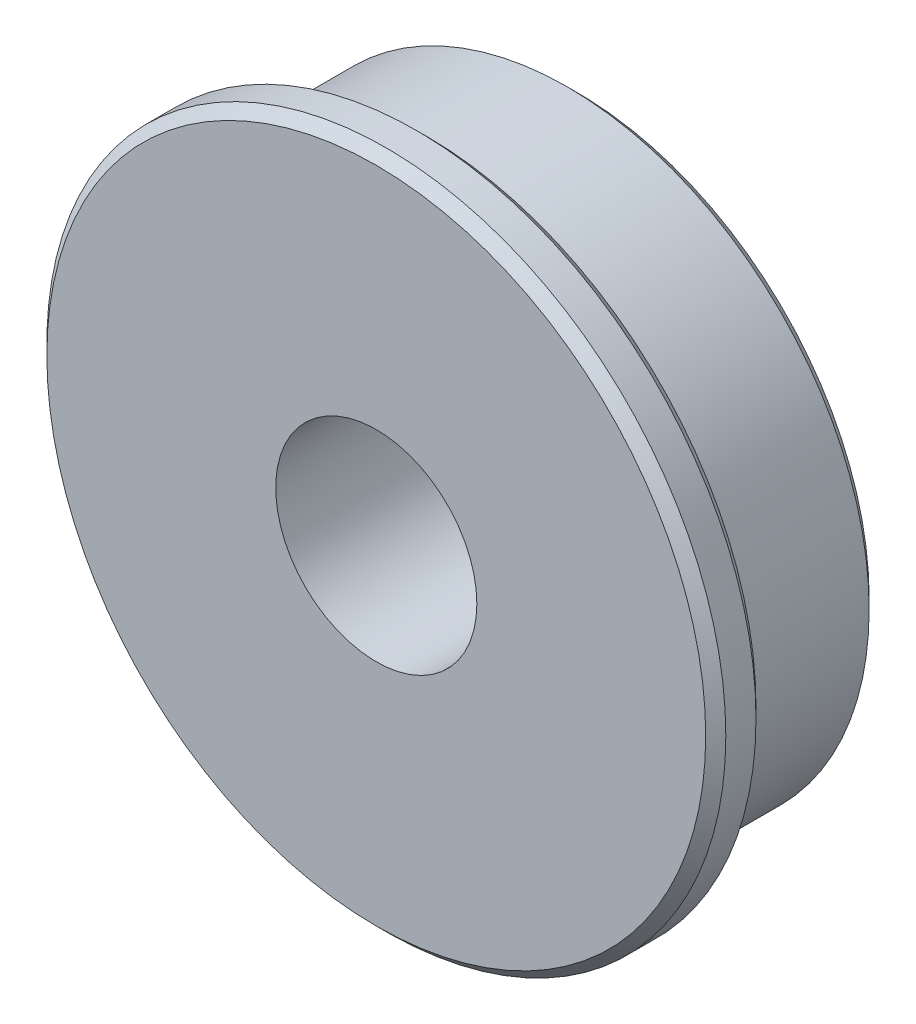
ISO-10303-21;
HEADER;
FILE_DESCRIPTION(('STEP AP214'),'2;1');
FILE_NAME('part.step','',(''),(''),'','','');
FILE_SCHEMA(('AUTOMOTIVE_DESIGN { 1 0 10303 214 1 1 1 1 }'));
ENDSEC;
DATA;
#1=APPLICATION_CONTEXT('core data for automotive mechanical design processes');
#2=APPLICATION_PROTOCOL_DEFINITION('international standard','automotive_design',2000,#1);
#3=PRODUCT_CONTEXT('',#1,'mechanical');
#4=PRODUCT('Part','Part','',(#3));
#5=PRODUCT_RELATED_PRODUCT_CATEGORY('part','',(#4));
#6=PRODUCT_DEFINITION_FORMATION('','',#4);
#7=PRODUCT_DEFINITION_CONTEXT('part definition',#1,'design');
#8=PRODUCT_DEFINITION('design','',#6,#7);
#9=PRODUCT_DEFINITION_SHAPE('','',#8);
#10=(LENGTH_UNIT() NAMED_UNIT(*) SI_UNIT(.MILLI.,.METRE.));
#11=(NAMED_UNIT(*) PLANE_ANGLE_UNIT() SI_UNIT($,.RADIAN.));
#12=(NAMED_UNIT(*) SI_UNIT($,.STERADIAN.) SOLID_ANGLE_UNIT());
#13=UNCERTAINTY_MEASURE_WITH_UNIT(LENGTH_MEASURE(1.E-05),#10,'distance_accuracy_value','');
#14=(GEOMETRIC_REPRESENTATION_CONTEXT(3) GLOBAL_UNCERTAINTY_ASSIGNED_CONTEXT((#13)) GLOBAL_UNIT_ASSIGNED_CONTEXT((#10,
#11,#12)) REPRESENTATION_CONTEXT('',''));
#15=CARTESIAN_POINT('',(0.,0.,0.));
#16=DIRECTION('',(0.,0.,1.));
#17=DIRECTION('',(1.,0.,0.));
#18=AXIS2_PLACEMENT_3D('',#15,#16,#17);
#19=CARTESIAN_POINT('',(0.,0.,2.));
#20=DIRECTION('',(0.,0.,-1.));
#21=DIRECTION('',(-1.,0.,0.));
#22=AXIS2_PLACEMENT_3D('',#19,#20,#21);
#23=CYLINDRICAL_SURFACE('',#22,6.);
#24=CARTESIAN_POINT('',(0.,0.,-1.8));
#25=DIRECTION('',(0.,0.,1.));
#26=DIRECTION('',(1.,0.,0.));
#27=AXIS2_PLACEMENT_3D('',#24,#25,#26);
#28=CIRCLE('',#27,6.);
#29=CARTESIAN_POINT('',(6.,0.,-1.8));
#30=VERTEX_POINT('',#29);
#31=EDGE_CURVE('E59',#30,#30,#28,.T.);
#32=ORIENTED_EDGE('',*,*,#31,.T.);
#33=EDGE_LOOP('',(#32));
#34=FACE_BOUND('',#33,.T.);
#35=CARTESIAN_POINT('',(0.,0.,1.));
#36=DIRECTION('',(0.,0.,1.));
#37=DIRECTION('',(1.,0.,0.));
#38=AXIS2_PLACEMENT_3D('',#35,#36,#37);
#39=CIRCLE('',#38,6.);
#40=CARTESIAN_POINT('',(6.,0.,1.));
#41=VERTEX_POINT('',#40);
#42=EDGE_CURVE('E62',#41,#41,#39,.T.);
#43=ORIENTED_EDGE('',*,*,#42,.F.);
#44=EDGE_LOOP('',(#43));
#45=FACE_BOUND('',#44,.T.);
#46=ADVANCED_FACE('F35',(#34,#45),#23,.T.);
#47=CARTESIAN_POINT('',(0.,0.,2.));
#48=DIRECTION('',(0.,0.,1.));
#49=DIRECTION('',(1.,0.,0.));
#50=AXIS2_PLACEMENT_3D('',#47,#48,#49);
#51=PLANE('',#50);
#52=CARTESIAN_POINT('',(0.,0.,2.));
#53=DIRECTION('',(0.,0.,1.));
#54=DIRECTION('',(1.,0.,0.));
#55=AXIS2_PLACEMENT_3D('',#52,#53,#54);
#56=CIRCLE('',#55,6.55);
#57=CARTESIAN_POINT('',(6.55,0.,2.));
#58=VERTEX_POINT('',#57);
#59=EDGE_CURVE('E10',#58,#58,#56,.T.);
#60=ORIENTED_EDGE('',*,*,#59,.T.);
#61=EDGE_LOOP('',(#60));
#62=FACE_BOUND('',#61,.T.);
#63=CARTESIAN_POINT('',(0.,0.,2.));
#64=DIRECTION('',(0.,0.,1.));
#65=DIRECTION('',(1.,0.,0.));
#66=AXIS2_PLACEMENT_3D('',#63,#64,#65);
#67=CIRCLE('',#66,2.);
#68=CARTESIAN_POINT('',(2.,0.,2.));
#69=VERTEX_POINT('',#68);
#70=EDGE_CURVE('E66',#69,#69,#67,.T.);
#71=ORIENTED_EDGE('',*,*,#70,.F.);
#72=EDGE_LOOP('',(#71));
#73=FACE_BOUND('',#72,.T.);
#74=ADVANCED_FACE('F75',(#62,#73),#51,.T.);
#75=CARTESIAN_POINT('',(0.,0.,-2.));
#76=DIRECTION('',(0.,0.,1.));
#77=DIRECTION('',(1.,0.,0.));
#78=AXIS2_PLACEMENT_3D('',#75,#76,#77);
#79=PLANE('',#78);
#80=CARTESIAN_POINT('',(0.,0.,-2.));
#81=DIRECTION('',(0.,0.,1.));
#82=DIRECTION('',(1.,0.,0.));
#83=AXIS2_PLACEMENT_3D('',#80,#81,#82);
#84=CIRCLE('',#83,5.8);
#85=CARTESIAN_POINT('',(5.8,0.,-2.));
#86=VERTEX_POINT('',#85);
#87=EDGE_CURVE('E56',#86,#86,#84,.F.);
#88=ORIENTED_EDGE('',*,*,#87,.T.);
#89=EDGE_LOOP('',(#88));
#90=FACE_BOUND('',#89,.T.);
#91=CARTESIAN_POINT('',(0.,0.,-2.));
#92=DIRECTION('',(0.,0.,1.));
#93=DIRECTION('',(1.,0.,0.));
#94=AXIS2_PLACEMENT_3D('',#91,#92,#93);
#95=CIRCLE('',#94,2.);
#96=CARTESIAN_POINT('',(2.,0.,-2.));
#97=VERTEX_POINT('',#96);
#98=EDGE_CURVE('E63',#97,#97,#95,.T.);
#99=ORIENTED_EDGE('',*,*,#98,.T.);
#100=EDGE_LOOP('',(#99));
#101=FACE_BOUND('',#100,.T.);
#102=ADVANCED_FACE('F81',(#90,#101),#79,.F.);
#103=CARTESIAN_POINT('',(0.,0.,2.));
#104=DIRECTION('',(0.,0.,-1.));
#105=DIRECTION('',(-1.,0.,0.));
#106=AXIS2_PLACEMENT_3D('',#103,#104,#105);
#107=CYLINDRICAL_SURFACE('',#106,2.);
#108=ORIENTED_EDGE('',*,*,#70,.T.);
#109=EDGE_LOOP('',(#108));
#110=FACE_BOUND('',#109,.T.);
#111=ORIENTED_EDGE('',*,*,#98,.F.);
#112=EDGE_LOOP('',(#111));
#113=FACE_BOUND('',#112,.T.);
#114=ADVANCED_FACE('F113',(#110,#113),#107,.F.);
#115=CARTESIAN_POINT('',(0.,0.,1.));
#116=DIRECTION('',(0.,0.,1.));
#117=DIRECTION('',(1.,0.,0.));
#118=AXIS2_PLACEMENT_3D('',#115,#116,#117);
#119=PLANE('',#118);
#120=CARTESIAN_POINT('',(0.,0.,1.));
#121=DIRECTION('',(0.,0.,1.));
#122=DIRECTION('',(1.,0.,0.));
#123=AXIS2_PLACEMENT_3D('',#120,#121,#122);
#124=CIRCLE('',#123,6.55);
#125=CARTESIAN_POINT('',(6.55,0.,1.));
#126=VERTEX_POINT('',#125);
#127=EDGE_CURVE('E43',#126,#126,#124,.F.);
#128=ORIENTED_EDGE('',*,*,#127,.T.);
#129=EDGE_LOOP('',(#128));
#130=FACE_BOUND('',#129,.T.);
#131=ORIENTED_EDGE('',*,*,#42,.T.);
#132=EDGE_LOOP('',(#131));
#133=FACE_BOUND('',#132,.T.);
#134=ADVANCED_FACE('F72',(#130,#133),#119,.F.);
#135=CARTESIAN_POINT('',(0.,0.,1.));
#136=DIRECTION('',(0.,0.,1.));
#137=DIRECTION('',(1.,0.,0.));
#138=AXIS2_PLACEMENT_3D('',#135,#136,#137);
#139=CYLINDRICAL_SURFACE('',#138,6.75);
#140=CARTESIAN_POINT('',(0.,0.,1.2));
#141=DIRECTION('',(0.,0.,1.));
#142=DIRECTION('',(1.,0.,0.));
#143=AXIS2_PLACEMENT_3D('',#140,#141,#142);
#144=CIRCLE('',#143,6.75);
#145=CARTESIAN_POINT('',(6.75,0.,1.2));
#146=VERTEX_POINT('',#145);
#147=EDGE_CURVE('E47',#146,#146,#144,.T.);
#148=ORIENTED_EDGE('',*,*,#147,.T.);
#149=EDGE_LOOP('',(#148));
#150=FACE_BOUND('',#149,.T.);
#151=CARTESIAN_POINT('',(0.,0.,1.8));
#152=DIRECTION('',(0.,0.,1.));
#153=DIRECTION('',(1.,0.,0.));
#154=AXIS2_PLACEMENT_3D('',#151,#152,#153);
#155=CIRCLE('',#154,6.75);
#156=CARTESIAN_POINT('',(6.75,0.,1.8));
#157=VERTEX_POINT('',#156);
#158=EDGE_CURVE('E51',#157,#157,#155,.F.);
#159=ORIENTED_EDGE('',*,*,#158,.T.);
#160=EDGE_LOOP('',(#159));
#161=FACE_BOUND('',#160,.T.);
#162=ADVANCED_FACE('F92',(#150,#161),#139,.T.);
#163=CARTESIAN_POINT('',(0.,0.,-1.8));
#164=DIRECTION('',(0.,0.,1.));
#165=DIRECTION('',(1.,0.,0.));
#166=AXIS2_PLACEMENT_3D('',#163,#164,#165);
#167=CONICAL_SURFACE('',#166,6.,0.785398163397453);
#168=CARTESIAN_POINT('',(5.8,0.,-2.));
#169=CARTESIAN_POINT('',(5.80208333333333,0.,-1.99791666666667));
#170=CARTESIAN_POINT('',(5.80416666666667,0.,-1.99583333333333));
#171=CARTESIAN_POINT('',(5.80833333333333,0.,-1.99166666666667));
#172=CARTESIAN_POINT('',(5.81041666666667,0.,-1.98958333333333));
#173=CARTESIAN_POINT('',(5.81458333333333,0.,-1.98541666666667));
#174=CARTESIAN_POINT('',(5.81666666666667,0.,-1.98333333333333));
#175=CARTESIAN_POINT('',(5.82083333333333,0.,-1.97916666666667));
#176=CARTESIAN_POINT('',(5.82291666666667,0.,-1.97708333333333));
#177=CARTESIAN_POINT('',(5.82708333333333,0.,-1.97291666666667));
#178=CARTESIAN_POINT('',(5.82916666666667,0.,-1.97083333333333));
#179=CARTESIAN_POINT('',(5.83333333333333,0.,-1.96666666666667));
#180=CARTESIAN_POINT('',(5.83541666666667,0.,-1.96458333333333));
#181=CARTESIAN_POINT('',(5.83958333333333,0.,-1.96041666666667));
#182=CARTESIAN_POINT('',(5.84166666666667,0.,-1.95833333333333));
#183=CARTESIAN_POINT('',(5.84583333333333,0.,-1.95416666666667));
#184=CARTESIAN_POINT('',(5.84791666666667,0.,-1.95208333333333));
#185=CARTESIAN_POINT('',(5.85208333333333,0.,-1.94791666666667));
#186=CARTESIAN_POINT('',(5.85416666666667,0.,-1.94583333333333));
#187=CARTESIAN_POINT('',(5.85833333333333,0.,-1.94166666666667));
#188=CARTESIAN_POINT('',(5.86041666666667,0.,-1.93958333333333));
#189=CARTESIAN_POINT('',(5.86458333333333,0.,-1.93541666666667));
#190=CARTESIAN_POINT('',(5.86666666666667,0.,-1.93333333333333));
#191=CARTESIAN_POINT('',(5.87083333333333,0.,-1.92916666666667));
#192=CARTESIAN_POINT('',(5.87291666666667,0.,-1.92708333333333));
#193=CARTESIAN_POINT('',(5.87708333333333,0.,-1.92291666666667));
#194=CARTESIAN_POINT('',(5.87916666666667,0.,-1.92083333333333));
#195=CARTESIAN_POINT('',(5.88333333333333,0.,-1.91666666666667));
#196=CARTESIAN_POINT('',(5.88541666666667,0.,-1.91458333333333));
#197=CARTESIAN_POINT('',(5.88958333333333,0.,-1.91041666666667));
#198=CARTESIAN_POINT('',(5.89166666666667,0.,-1.90833333333333));
#199=CARTESIAN_POINT('',(5.89583333333333,0.,-1.90416666666667));
#200=CARTESIAN_POINT('',(5.89791666666667,0.,-1.90208333333333));
#201=CARTESIAN_POINT('',(5.90208333333333,0.,-1.89791666666667));
#202=CARTESIAN_POINT('',(5.90416666666667,0.,-1.89583333333333));
#203=CARTESIAN_POINT('',(5.90833333333333,0.,-1.89166666666667));
#204=CARTESIAN_POINT('',(5.91041666666667,0.,-1.88958333333333));
#205=CARTESIAN_POINT('',(5.91458333333333,0.,-1.88541666666667));
#206=CARTESIAN_POINT('',(5.91666666666667,0.,-1.88333333333333));
#207=CARTESIAN_POINT('',(5.92083333333333,0.,-1.87916666666667));
#208=CARTESIAN_POINT('',(5.92291666666667,0.,-1.87708333333333));
#209=CARTESIAN_POINT('',(5.92708333333333,0.,-1.87291666666667));
#210=CARTESIAN_POINT('',(5.92916666666667,0.,-1.87083333333333));
#211=CARTESIAN_POINT('',(5.93333333333333,0.,-1.86666666666667));
#212=CARTESIAN_POINT('',(5.93541666666667,0.,-1.86458333333333));
#213=CARTESIAN_POINT('',(5.93958333333333,0.,-1.86041666666667));
#214=CARTESIAN_POINT('',(5.94166666666667,0.,-1.85833333333333));
#215=CARTESIAN_POINT('',(5.94583333333333,0.,-1.85416666666667));
#216=CARTESIAN_POINT('',(5.94791666666667,0.,-1.85208333333333));
#217=CARTESIAN_POINT('',(5.95208333333333,0.,-1.84791666666667));
#218=CARTESIAN_POINT('',(5.95416666666667,0.,-1.84583333333333));
#219=CARTESIAN_POINT('',(5.95833333333333,0.,-1.84166666666667));
#220=CARTESIAN_POINT('',(5.96041666666667,0.,-1.83958333333333));
#221=CARTESIAN_POINT('',(5.96458333333333,0.,-1.83541666666667));
#222=CARTESIAN_POINT('',(5.96666666666667,0.,-1.83333333333333));
#223=CARTESIAN_POINT('',(5.97083333333333,0.,-1.82916666666667));
#224=CARTESIAN_POINT('',(5.97291666666667,0.,-1.82708333333333));
#225=CARTESIAN_POINT('',(5.97708333333333,0.,-1.82291666666667));
#226=CARTESIAN_POINT('',(5.97916666666667,0.,-1.82083333333333));
#227=CARTESIAN_POINT('',(5.98333333333333,0.,-1.81666666666667));
#228=CARTESIAN_POINT('',(5.98541666666667,0.,-1.81458333333333));
#229=CARTESIAN_POINT('',(5.98958333333333,0.,-1.81041666666667));
#230=CARTESIAN_POINT('',(5.99166666666667,0.,-1.80833333333333));
#231=CARTESIAN_POINT('',(5.99583333333333,0.,-1.80416666666667));
#232=CARTESIAN_POINT('',(5.99791666666667,0.,-1.80208333333333));
#233=CARTESIAN_POINT('',(6.,0.,-1.8));
#234=B_SPLINE_CURVE_WITH_KNOTS('',3,(#168,#169,#170,#171,#172,#173,#174,#175,#176,#177,#178,
#179,#180,#181,#182,#183,#184,#185,#186,#187,#188,#189,#190,#191,#192,#193,#194,#195,#196,#197,
#198,#199,#200,#201,#202,#203,#204,#205,#206,#207,#208,#209,#210,#211,#212,#213,#214,#215,#216,
#217,#218,#219,#220,#221,#222,#223,#224,#225,#226,#227,#228,#229,#230,#231,#232,#233),
.UNSPECIFIED.,.F.,.F.,(4,2,2,2,2,2,2,2,2,2,2,2,2,2,2,2,2,2,2,2,2,2,2,2,2,2,2,2,2,2,2,2,4),(0.,
0.00883883476483148,0.0176776695296636,0.0265165042944954,0.0353553390593275,0.0441941738241593,
0.0530330085889914,0.0618718433538231,0.0707106781186546,0.0795495128834866,0.0883883476483185,
0.0972271824131506,0.106066017177983,0.114904851942814,0.123743686707646,0.132582521472478,
0.14142135623731,0.150260191002142,0.159099025766974,0.167937860531806,0.176776695296638,
0.18561553006147,0.194454364826301,0.203293199591133,0.212132034355965,0.220970869120797,
0.229809703885629,0.238648538650461,0.247487373415292,0.256326208180124,0.265165042944956,
0.274003877709788,0.28284271247462),.UNSPECIFIED.);
#235=EDGE_CURVE('BSEAM86',#86,#30,#234,.T.);
#236=ORIENTED_EDGE('',*,*,#87,.F.);
#237=ORIENTED_EDGE('',*,*,#31,.F.);
#238=ORIENTED_EDGE('',*,*,#235,.T.);
#239=ORIENTED_EDGE('',*,*,#235,.F.);
#240=EDGE_LOOP('',(#236,#238,#237,#239));
#241=FACE_BOUND('',#240,.T.);
#242=ADVANCED_FACE('F86',(#241),#167,.T.);
#243=CARTESIAN_POINT('',(0.,0.,1.2));
#244=DIRECTION('',(0.,0.,1.));
#245=DIRECTION('',(1.,0.,0.));
#246=AXIS2_PLACEMENT_3D('',#243,#244,#245);
#247=CONICAL_SURFACE('',#246,6.75,0.785398163397448);
#248=ORIENTED_EDGE('',*,*,#127,.F.);
#249=EDGE_LOOP('',(#248));
#250=FACE_BOUND('',#249,.T.);
#251=ORIENTED_EDGE('',*,*,#147,.F.);
#252=EDGE_LOOP('',(#251));
#253=FACE_BOUND('',#252,.T.);
#254=ADVANCED_FACE('F91',(#250,#253),#247,.T.);
#255=CARTESIAN_POINT('',(0.,0.,2.));
#256=DIRECTION('',(0.,0.,-1.));
#257=DIRECTION('',(-1.,0.,0.));
#258=AXIS2_PLACEMENT_3D('',#255,#256,#257);
#259=CONICAL_SURFACE('',#258,6.55,0.785398163397448);
#260=ORIENTED_EDGE('',*,*,#158,.F.);
#261=EDGE_LOOP('',(#260));
#262=FACE_BOUND('',#261,.T.);
#263=ORIENTED_EDGE('',*,*,#59,.F.);
#264=EDGE_LOOP('',(#263));
#265=FACE_BOUND('',#264,.T.);
#266=ADVANCED_FACE('F38',(#262,#265),#259,.T.);
#267=CLOSED_SHELL('',(#46,#74,#102,#114,#134,#162,#242,#254,#266));
#268=MANIFOLD_SOLID_BREP('B2',#267);
#269=ADVANCED_BREP_SHAPE_REPRESENTATION('',(#18,#268),#14);
#270=SHAPE_DEFINITION_REPRESENTATION(#9,#269);
ENDSEC;
END-ISO-10303-21;
